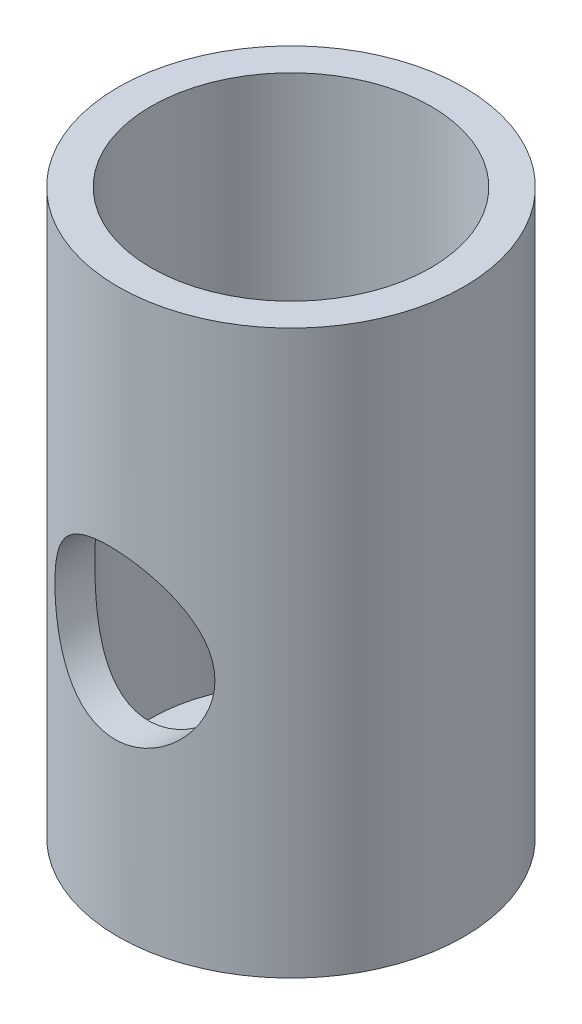
ISO-10303-21;
HEADER;
FILE_DESCRIPTION(('STEP AP214'),'2;1');
FILE_NAME('part.step','',(''),(''),'','','');
FILE_SCHEMA(('AUTOMOTIVE_DESIGN { 1 0 10303 214 1 1 1 1 }'));
ENDSEC;
DATA;
#1=APPLICATION_CONTEXT('core data for automotive mechanical design processes');
#2=APPLICATION_PROTOCOL_DEFINITION('international standard','automotive_design',2000,#1);
#3=PRODUCT_CONTEXT('',#1,'mechanical');
#4=PRODUCT('Part','Part','',(#3));
#5=PRODUCT_RELATED_PRODUCT_CATEGORY('part','',(#4));
#6=PRODUCT_DEFINITION_FORMATION('','',#4);
#7=PRODUCT_DEFINITION_CONTEXT('part definition',#1,'design');
#8=PRODUCT_DEFINITION('design','',#6,#7);
#9=PRODUCT_DEFINITION_SHAPE('','',#8);
#10=(LENGTH_UNIT() NAMED_UNIT(*) SI_UNIT(.MILLI.,.METRE.));
#11=(NAMED_UNIT(*) PLANE_ANGLE_UNIT() SI_UNIT($,.RADIAN.));
#12=(NAMED_UNIT(*) SI_UNIT($,.STERADIAN.) SOLID_ANGLE_UNIT());
#13=UNCERTAINTY_MEASURE_WITH_UNIT(LENGTH_MEASURE(1.E-05),#10,'distance_accuracy_value','');
#14=(GEOMETRIC_REPRESENTATION_CONTEXT(3) GLOBAL_UNCERTAINTY_ASSIGNED_CONTEXT((#13)) GLOBAL_UNIT_ASSIGNED_CONTEXT((#10,
#11,#12)) REPRESENTATION_CONTEXT('',''));
#15=CARTESIAN_POINT('',(0.,0.,0.));
#16=DIRECTION('',(0.,0.,1.));
#17=DIRECTION('',(1.,0.,0.));
#18=AXIS2_PLACEMENT_3D('',#15,#16,#17);
#19=CARTESIAN_POINT('',(0.,8.34615384615383,0.));
#20=DIRECTION('',(0.,1.,0.));
#21=DIRECTION('',(0.,0.,1.));
#22=AXIS2_PLACEMENT_3D('',#19,#20,#21);
#23=CYLINDRICAL_SURFACE('',#22,4.25);
#24=CARTESIAN_POINT('',(0.,-6.1841287743049,4.25));
#25=CARTESIAN_POINT('',(-0.126514666618864,-6.18999383435395,4.24999357675358));
#26=CARTESIAN_POINT('',(-0.253690544824862,-6.18621727224472,4.24428961678559));
#27=CARTESIAN_POINT('',(-0.505174990812462,-6.15950782159321,4.22176751840019));
#28=CARTESIAN_POINT('',(-0.629476029136012,-6.13652944570461,4.20492300881492));
#29=CARTESIAN_POINT('',(-0.871018738387213,-6.07269274435159,4.16158855279518));
#30=CARTESIAN_POINT('',(-0.988287978038754,-6.03191025681268,4.13513959671847));
#31=CARTESIAN_POINT('',(-1.21367958466996,-5.9342082029281,4.07469224340072));
#32=CARTESIAN_POINT('',(-1.3218039707566,-5.87729221086477,4.04069551868434));
#33=CARTESIAN_POINT('',(-1.53381237306319,-5.74498566002787,3.96527125665009));
#34=CARTESIAN_POINT('',(-1.63698126462261,-5.66864532277555,3.92350725096742));
#35=CARTESIAN_POINT('',(-1.82974834727165,-5.50150390378703,3.8374067317543));
#36=CARTESIAN_POINT('',(-1.91933173664799,-5.41068726755903,3.7930674841264));
#37=CARTESIAN_POINT('',(-2.09426877256489,-5.2036116362868,3.69967236270858));
#38=CARTESIAN_POINT('',(-2.17760701788026,-5.08558345882298,3.65074074508858));
#39=CARTESIAN_POINT('',(-2.32350862182033,-4.83494867455851,3.55966548219708));
#40=CARTESIAN_POINT('',(-2.38609165861652,-4.70235603616597,3.51751542691352));
#41=CARTESIAN_POINT('',(-2.47754406867953,-4.45364265090442,3.45351048312897));
#42=CARTESIAN_POINT('',(-2.51069464631352,-4.33971716241002,3.42926645817422));
#43=CARTESIAN_POINT('',(-2.56087229612731,-4.10665113582559,3.39196573914914));
#44=CARTESIAN_POINT('',(-2.57792086795207,-3.98751777451828,3.3788941297226));
#45=CARTESIAN_POINT('',(-2.59499643547816,-3.74685172088692,3.36580205868286));
#46=CARTESIAN_POINT('',(-2.59496115240666,-3.62531186504052,3.36582934878257));
#47=CARTESIAN_POINT('',(-2.57771157351003,-3.38416213535658,3.37905440543921));
#48=CARTESIAN_POINT('',(-2.5604886278881,-3.26455326409748,3.39225880345659));
#49=CARTESIAN_POINT('',(-2.51108019565003,-3.03635055830551,3.42897235946233));
#50=CARTESIAN_POINT('',(-2.47964981382018,-2.92750350601173,3.45195840136881));
#51=CARTESIAN_POINT('',(-2.4033522226344,-2.71663804365373,3.50550457872394));
#52=CARTESIAN_POINT('',(-2.35848010215552,-2.61462214614226,3.53606748177752));
#53=CARTESIAN_POINT('',(-2.24898322052313,-2.40432715849895,3.60685611183844));
#54=CARTESIAN_POINT('',(-2.18243055865302,-2.29731001637681,3.64784118870707));
#55=CARTESIAN_POINT('',(-2.03451340901586,-2.09510543361018,3.73236094898881));
#56=CARTESIAN_POINT('',(-1.95313602922578,-1.99992841168536,3.77589782899951));
#57=CARTESIAN_POINT('',(-1.76293361362987,-1.80894174272526,3.86877738084415));
#58=CARTESIAN_POINT('',(-1.65180832134746,-1.71533338902338,3.91797058454251));
#59=CARTESIAN_POINT('',(-1.41293139861074,-1.5482000202233,4.01029344257288));
#60=CARTESIAN_POINT('',(-1.2851822656441,-1.47467199348259,4.05342400570683));
#61=CARTESIAN_POINT('',(-1.08555899881474,-1.38281409172062,4.10958371322555));
#62=CARTESIAN_POINT('',(-1.01880850826964,-1.35556325383551,4.12667256667526));
#63=CARTESIAN_POINT('',(-0.882580649020144,-1.30685885172821,4.15793480397587));
#64=CARTESIAN_POINT('',(-0.813104783309145,-1.28540214222901,4.17210976859648));
#65=CARTESIAN_POINT('',(-0.67202042884362,-1.24861953950318,4.19714367097884));
#66=CARTESIAN_POINT('',(-0.6004136951346,-1.23328874317741,4.20800525906891));
#67=CARTESIAN_POINT('',(-0.455708543658157,-1.20898489536705,4.22612811744373));
#68=CARTESIAN_POINT('',(-0.382610363394658,-1.20001083961457,4.2333899563794));
#69=CARTESIAN_POINT('',(-0.181935087646649,-1.18443818691528,4.24800800708538));
#70=CARTESIAN_POINT('',(-0.0534915765804219,-1.18434087929156,4.25157350709012));
#71=CARTESIAN_POINT('',(0.201605679363006,-1.20375397418313,4.24713593635522));
#72=CARTESIAN_POINT('',(0.328259647696081,-1.22326190630139,4.2391343230969));
#73=CARTESIAN_POINT('',(0.570424400935169,-1.27949639530463,4.2132261721413));
#74=CARTESIAN_POINT('',(0.686179968692407,-1.31539782523347,4.19578759780555));
#75=CARTESIAN_POINT('',(0.910120277557902,-1.40261254074907,4.1529743182449));
#76=CARTESIAN_POINT('',(1.0183037273232,-1.45392844725046,4.12759826338439));
#77=CARTESIAN_POINT('',(1.23425590034486,-1.57542819818207,4.0685021541934));
#78=CARTESIAN_POINT('',(1.34117119839328,-1.64686436933713,4.03424854914975));
#79=CARTESIAN_POINT('',(1.54230637078616,-1.80421182805936,3.96172275856481));
#80=CARTESIAN_POINT('',(1.63651369483395,-1.89013723940924,3.92344666584402));
#81=CARTESIAN_POINT('',(1.82230950679165,-2.08704330119518,3.84100405010942));
#82=CARTESIAN_POINT('',(1.91194006083298,-2.19983145151491,3.7967224601713));
#83=CARTESIAN_POINT('',(2.07120125371938,-2.44013756777743,3.71224452977605));
#84=CARTESIAN_POINT('',(2.14084279813082,-2.56764744841272,3.67204596947216));
#85=CARTESIAN_POINT('',(2.24716325220022,-2.81137155295058,3.6077577978193));
#86=CARTESIAN_POINT('',(2.28750172825658,-2.92556162884501,3.58207472263222));
#87=CARTESIAN_POINT('',(2.35119718021974,-3.16025597574136,3.54059839948225));
#88=CARTESIAN_POINT('',(2.37457714446191,-3.28075146075516,3.52479176742166));
#89=CARTESIAN_POINT('',(2.40309640665322,-3.52552758175673,3.50541702513897));
#90=CARTESIAN_POINT('',(2.40814400151191,-3.6498241192746,3.50191044583025));
#91=CARTESIAN_POINT('',(2.39937479332966,-3.89744805113943,3.50792286418429));
#92=CARTESIAN_POINT('',(2.38555322147207,-4.02077519256675,3.51744515464306));
#93=CARTESIAN_POINT('',(2.34168510363635,-4.25353781665026,3.54677645448124));
#94=CARTESIAN_POINT('',(2.31291493449706,-4.36332593264543,3.5657720758225));
#95=CARTESIAN_POINT('',(2.2413188959296,-4.57656194764027,3.6112018145413));
#96=CARTESIAN_POINT('',(2.19848741288769,-4.68000729484828,3.63763890212854));
#97=CARTESIAN_POINT('',(2.09389428545067,-4.89170512976959,3.69894804539195));
#98=CARTESIAN_POINT('',(2.03042931052664,-4.99892591250037,3.73446278193416));
#99=CARTESIAN_POINT('',(1.88890203685276,-5.20233201323108,3.80800642879627));
#100=CARTESIAN_POINT('',(1.81082935259192,-5.29850940081483,3.84603711534574));
#101=CARTESIAN_POINT('',(1.62700370253564,-5.49386807095238,3.92773600867962));
#102=CARTESIAN_POINT('',(1.51880284110005,-5.59081546321852,3.97127207593085));
#103=CARTESIAN_POINT('',(1.28586921846299,-5.76580943233594,4.05268047724306));
#104=CARTESIAN_POINT('',(1.16112561946813,-5.84384352275468,4.0905490633966));
#105=CARTESIAN_POINT('',(0.964208398986665,-5.94421996695848,4.1397320819291));
#106=CARTESIAN_POINT('',(0.897093258983838,-5.97485070182926,4.15483165619078));
#107=CARTESIAN_POINT('',(0.759945757492538,-6.03030794919778,4.18208754173388));
#108=CARTESIAN_POINT('',(0.689915066477385,-6.05513773288055,4.19424551193879));
#109=CARTESIAN_POINT('',(0.547699899983057,-6.09857405875874,4.21517237649846));
#110=CARTESIAN_POINT('',(0.475522716769744,-6.11719951953836,4.22395158652585));
#111=CARTESIAN_POINT('',(0.329503532965402,-6.14801768956562,4.23784093936173));
#112=CARTESIAN_POINT('',(0.25566304538905,-6.16021601692259,4.24295428800148));
#113=CARTESIAN_POINT('',(0.151263677620319,-6.17269531153148,4.24741442638629));
#114=CARTESIAN_POINT('',(0.121080707660853,-6.17574934705927,4.2483821572176));
#115=CARTESIAN_POINT('',(0.0606111605110757,-6.18076322272879,4.24967574242153));
#116=CARTESIAN_POINT('',(0.0303245743299795,-6.18272296536464,4.25000153960184));
#117=CARTESIAN_POINT('',(0.,-6.1841287743049,4.25));
#118=B_SPLINE_CURVE_WITH_KNOTS('',3,(#24,#25,#26,#27,#28,#29,#30,#31,#32,#33,#34,#35,#36,#37,
#38,#39,#40,#41,#42,#43,#44,#45,#46,#47,#48,#49,#50,#51,#52,#53,#54,#55,#56,#57,#58,#59,#60,#61,
#62,#63,#64,#65,#66,#67,#68,#69,#70,#71,#72,#73,#74,#75,#76,#77,#78,#79,#80,#81,#82,#83,#84,#85,
#86,#87,#88,#89,#90,#91,#92,#93,#94,#95,#96,#97,#98,#99,#100,#101,#102,#103,#104,#105,#106,#107,
#108,#109,#110,#111,#112,#113,#114,#115,#116,#117),.UNSPECIFIED.,.T.,.F.,(4,2,2,2,2,2,2,2,2,2,2,
2,2,2,2,2,2,2,2,2,2,2,2,2,2,2,2,2,2,2,2,2,2,2,2,2,2,2,2,2,2,2,2,2,2,2,4),(0.,0.379829153106347,
0.760560646015882,1.13968597170252,1.51872736997747,1.92204551536012,2.32579997592246,
2.78132798436538,3.23642286023476,3.5982258027192,3.95954497457143,4.3221813364587,
4.68500028940197,5.03046462091768,5.3760553268178,5.77212875702492,6.16854828331844,
6.6265872615563,7.08455750544692,7.3065702503893,7.52846223484674,7.75017626245955,
7.97185525482667,8.35514394945396,8.73838435308527,9.10416122651134,9.47000032800766,
9.86763896110209,10.2656674680136,10.7158110881104,11.165708650843,11.5355937330201,
11.904976470721,12.276204427787,12.6475262229045,12.9913693551252,13.335349925039,
13.722592784186,14.1101120113006,14.5630513636229,15.0162889338302,15.2419219100951,
15.4674273420372,15.6922387170591,15.9168532517452,16.007887213538,16.0989292855277),.UNSPECIFIED.);
#119=CARTESIAN_POINT('',(0.,-6.1841287743049,4.25));
#120=VERTEX_POINT('',#119);
#121=EDGE_CURVE('E81',#120,#120,#118,.T.);
#122=ORIENTED_EDGE('',*,*,#121,.F.);
#123=EDGE_LOOP('',(#122));
#124=FACE_BOUND('',#123,.T.);
#125=CARTESIAN_POINT('',(2.59284200411313,-3.68681939527953,-3.36744270058254));
#126=CARTESIAN_POINT('',(2.59284415220385,-3.56043270982859,-3.36743977286373));
#127=CARTESIAN_POINT('',(2.58339559429246,-3.4340571917981,-3.37477916132106));
#128=CARTESIAN_POINT('',(2.54624608856951,-3.18551481318329,-3.40288829542865));
#129=CARTESIAN_POINT('',(2.51852640738754,-3.06335240772422,-3.42367182494));
#130=CARTESIAN_POINT('',(2.44658419144467,-2.82734776399845,-3.4754351606602));
#131=CARTESIAN_POINT('',(2.4024755143808,-2.71345445679809,-3.50634444982034));
#132=CARTESIAN_POINT('',(2.2993030219013,-2.49488562791326,-3.57484744079851));
#133=CARTESIAN_POINT('',(2.24023447384262,-2.39021303740703,-3.61244325681582));
#134=CARTESIAN_POINT('',(2.10067851866628,-2.17961323028469,-3.69553543052024));
#135=CARTESIAN_POINT('',(2.01849364681623,-2.0749722310546,-3.74144149683859));
#136=CARTESIAN_POINT('',(1.83836378486604,-1.88010399032773,-3.83316415581972));
#137=CARTESIAN_POINT('',(1.74040770352969,-1.7898869822729,-3.87898066237803));
#138=CARTESIAN_POINT('',(1.51923229526114,-1.6172971268631,-3.97117087973103));
#139=CARTESIAN_POINT('',(1.3944530238858,-1.53667418400921,-4.01712100315428));
#140=CARTESIAN_POINT('',(1.12987341699404,-1.39837409684681,-4.09939155616356));
#141=CARTESIAN_POINT('',(0.990086425563689,-1.34067677939849,-4.1357204424157));
#142=CARTESIAN_POINT('',(0.713070096690742,-1.2555513957581,-4.19191098129795));
#143=CARTESIAN_POINT('',(0.576801259803329,-1.22581622979372,-4.21298544507584));
#144=CARTESIAN_POINT('',(0.299856954676447,-1.18968496271981,-4.2416860733077));
#145=CARTESIAN_POINT('',(0.159185532488307,-1.18326803220993,-4.24932423681093));
#146=CARTESIAN_POINT('',(-0.104465981241452,-1.19348493478511,-4.25051529014477));
#147=CARTESIAN_POINT('',(-0.227554192142381,-1.20745966384652,-4.24564011475217));
#148=CARTESIAN_POINT('',(-0.469549131632264,-1.25304753407556,-4.22572618334815));
#149=CARTESIAN_POINT('',(-0.588455550620177,-1.2846619782982,-4.21068667647491));
#150=CARTESIAN_POINT('',(-0.819977111325494,-1.36441419869967,-4.17181404796222));
#151=CARTESIAN_POINT('',(-0.932541195835752,-1.41266849200855,-4.147918825363));
#152=CARTESIAN_POINT('',(-1.14832181492216,-1.52394067413266,-4.09344084046244));
#153=CARTESIAN_POINT('',(-1.25153577280166,-1.58696261554068,-4.06285624259164));
#154=CARTESIAN_POINT('',(-1.45857223279885,-1.73430761995599,-3.9935361733302));
#155=CARTESIAN_POINT('',(-1.56105554914368,-1.82025950694558,-3.95426582869307));
#156=CARTESIAN_POINT('',(-1.75105761437764,-2.00680810558783,-3.87388251218567));
#157=CARTESIAN_POINT('',(-1.83855661676525,-2.10742382326416,-3.83276719762934));
#158=CARTESIAN_POINT('',(-2.00564482737587,-2.3334914291899,-3.74827534678366));
#159=CARTESIAN_POINT('',(-2.08332945271227,-2.46045534885354,-3.70514153385681));
#160=CARTESIAN_POINT('',(-2.21556694844077,-2.72829567897284,-3.62762667285151));
#161=CARTESIAN_POINT('',(-2.27016194293263,-2.86914617093663,-3.59322973167139));
#162=CARTESIAN_POINT('',(-2.34314096965645,-3.12603900491953,-3.54592804344307));
#163=CARTESIAN_POINT('',(-2.36707129624866,-3.23992088070366,-3.52984626677697));
#164=CARTESIAN_POINT('',(-2.39853847709991,-3.4708811871911,-3.50854583974423));
#165=CARTESIAN_POINT('',(-2.40609295542564,-3.58795604394084,-3.50331551105866));
#166=CARTESIAN_POINT('',(-2.40436558990165,-3.82203409434476,-3.50450073796037));
#167=CARTESIAN_POINT('',(-2.39506640446923,-3.93903709012681,-3.51092828893175));
#168=CARTESIAN_POINT('',(-2.36017519595914,-4.16950435446358,-3.53447285609251));
#169=CARTESIAN_POINT('',(-2.33457068470238,-4.2829658406583,-3.55159806538067));
#170=CARTESIAN_POINT('',(-2.26820310747023,-4.50421684281691,-3.59434296938122));
#171=CARTESIAN_POINT('',(-2.22736671044123,-4.61197599252573,-3.62000369095848));
#172=CARTESIAN_POINT('',(-2.13201030300669,-4.81961724591989,-3.6769704809898));
#173=CARTESIAN_POINT('',(-2.07748495833774,-4.91949625891299,-3.70827874881893));
#174=CARTESIAN_POINT('',(-1.94536255797351,-5.12702664086778,-3.77950057978961));
#175=CARTESIAN_POINT('',(-1.86539877399956,-5.23298604646701,-3.81996182968313));
#176=CARTESIAN_POINT('',(-1.68985742931875,-5.43123055098277,-3.90079936177709));
#177=CARTESIAN_POINT('',(-1.59426570352933,-5.52350309812734,-3.94117553291746));
#178=CARTESIAN_POINT('',(-1.37684436873676,-5.70259348610109,-4.02265930342844));
#179=CARTESIAN_POINT('',(-1.25325335226621,-5.78750909599826,-4.06329947675685));
#180=CARTESIAN_POINT('',(-0.990931098913845,-5.93512385489279,-4.13509281803652));
#181=CARTESIAN_POINT('',(-0.852210963513369,-5.99783915251383,-4.16625287954261));
#182=CARTESIAN_POINT('',(-0.574688004781045,-6.09397174299784,-4.21313176776311));
#183=CARTESIAN_POINT('',(-0.436713912115765,-6.12927304432844,-4.22985476795968));
#184=CARTESIAN_POINT('',(-0.155865230961745,-6.17604974361841,-4.24946419672817));
#185=CARTESIAN_POINT('',(-0.0129958150158259,-6.1875495470081,-4.25236480240001));
#186=CARTESIAN_POINT('',(0.254053826516153,-6.18611236447814,-4.24423457422322));
#187=CARTESIAN_POINT('',(0.378314190184773,-6.17607990900319,-4.23491799564233));
#188=CARTESIAN_POINT('',(0.622746356137685,-6.13785244135407,-4.2059278022183));
#189=CARTESIAN_POINT('',(0.74291803358543,-6.10965687514334,-4.18625387144407));
#190=CARTESIAN_POINT('',(0.975116098223649,-6.03672750988245,-4.13830974046805));
#191=CARTESIAN_POINT('',(1.08720161337546,-5.99213236980307,-4.11011195567485));
#192=CARTESIAN_POINT('',(1.30217885749524,-5.88802932616895,-4.04714622180622));
#193=CARTESIAN_POINT('',(1.40506835210519,-5.82851781167147,-4.01237668234815));
#194=CARTESIAN_POINT('',(1.6109060435566,-5.68893657128946,-3.93457420596166));
#195=CARTESIAN_POINT('',(1.71262487763647,-5.60732857020849,-3.89105326161103));
#196=CARTESIAN_POINT('',(1.9016741384695,-5.42953902585991,-3.80224529511432));
#197=CARTESIAN_POINT('',(1.98898758616951,-5.33334053797708,-3.75695626562162));
#198=CARTESIAN_POINT('',(2.15732960497347,-5.11573600849875,-3.66316272328516));
#199=CARTESIAN_POINT('',(2.23640152449953,-4.99269501010383,-3.61490918881245));
#200=CARTESIAN_POINT('',(2.37277636873223,-4.73230690622967,-3.52690284232553));
#201=CARTESIAN_POINT('',(2.43010188081769,-4.59497483452628,-3.48714122886215));
#202=CARTESIAN_POINT('',(2.51362627326231,-4.33019613700448,-3.42730820010169));
#203=CARTESIAN_POINT('',(2.54316950192293,-4.20428001091333,-3.40519734354361));
#204=CARTESIAN_POINT('',(2.58276101961938,-3.94784006613291,-3.3752772840322));
#205=CARTESIAN_POINT('',(2.59283978603729,-3.8173237772329,-3.36744572368685));
#206=CARTESIAN_POINT('',(2.59284200411313,-3.68681939527953,-3.36744270058254));
#207=B_SPLINE_CURVE_WITH_KNOTS('',3,(#125,#126,#127,#128,#129,#130,#131,#132,#133,#134,#135,
#136,#137,#138,#139,#140,#141,#142,#143,#144,#145,#146,#147,#148,#149,#150,#151,#152,#153,#154,
#155,#156,#157,#158,#159,#160,#161,#162,#163,#164,#165,#166,#167,#168,#169,#170,#171,#172,#173,
#174,#175,#176,#177,#178,#179,#180,#181,#182,#183,#184,#185,#186,#187,#188,#189,#190,#191,#192,
#193,#194,#195,#196,#197,#198,#199,#200,#201,#202,#203,#204,#205,#206),.UNSPECIFIED.,.T.,.F.,(4,
2,2,2,2,2,2,2,2,2,2,2,2,2,2,2,2,2,2,2,2,2,2,2,2,2,2,2,2,2,2,2,2,2,2,2,2,2,2,2,4),(0.,
0.378613275481539,0.757615348000445,1.13403220145297,1.51056828566074,1.93116144998214,
2.35205170246896,2.81605180661519,3.27964271020139,3.70033094777358,4.12064330610089,
4.49080308687508,4.86099021516698,5.23382398600492,5.60676019134102,6.02329014830462,
6.44036485842647,6.9029445871221,7.36467671888197,7.71557767181679,8.06610078914523,
8.41698478213428,8.76813783941288,9.12100374781948,9.474007373842,9.88869995713499,
10.3037705209631,10.7674183259368,11.2307281746553,11.658365498045,12.0855641156922,
12.4587756980608,12.8319986651897,13.2021359692981,13.5723629626045,13.9831647186666,
14.394447263709,14.8542501925614,15.313574220876,15.7051363769045,16.0960849276934),.UNSPECIFIED.);
#208=CARTESIAN_POINT('',(2.59284200411313,-3.68681939527953,-3.36744270058254));
#209=VERTEX_POINT('',#208);
#210=EDGE_CURVE('E62',#209,#209,#207,.T.);
#211=ORIENTED_EDGE('',*,*,#210,.F.);
#212=EDGE_LOOP('',(#211));
#213=FACE_BOUND('',#212,.T.);
#214=CARTESIAN_POINT('',(0.,5.76923076923076,0.));
#215=DIRECTION('',(0.,1.,0.));
#216=DIRECTION('',(0.,0.,1.));
#217=AXIS2_PLACEMENT_3D('',#214,#215,#216);
#218=CIRCLE('',#217,4.25);
#219=CARTESIAN_POINT('',(0.,5.76923076923076,4.25));
#220=VERTEX_POINT('',#219);
#221=EDGE_CURVE('E46',#220,#220,#218,.T.);
#222=ORIENTED_EDGE('',*,*,#221,.T.);
#223=EDGE_LOOP('',(#222));
#224=FACE_BOUND('',#223,.T.);
#225=CARTESIAN_POINT('',(0.,-10.3286562181495,0.));
#226=DIRECTION('',(0.,1.,0.));
#227=DIRECTION('',(0.,0.,1.));
#228=AXIS2_PLACEMENT_3D('',#225,#226,#227);
#229=CIRCLE('',#228,4.25);
#230=CARTESIAN_POINT('',(0.,-10.3286562181495,4.25));
#231=VERTEX_POINT('',#230);
#232=EDGE_CURVE('E86',#231,#231,#229,.T.);
#233=ORIENTED_EDGE('',*,*,#232,.F.);
#234=EDGE_LOOP('',(#233));
#235=FACE_BOUND('',#234,.T.);
#236=ADVANCED_FACE('F35',(#124,#213,#224,#235),#23,.F.);
#237=CARTESIAN_POINT('',(-4.25,5.76923076923076,0.));
#238=DIRECTION('',(0.,1.,0.));
#239=DIRECTION('',(0.,0.,1.));
#240=AXIS2_PLACEMENT_3D('',#237,#238,#239);
#241=PLANE('',#240);
#242=CARTESIAN_POINT('',(0.,5.76923076923076,0.));
#243=DIRECTION('',(0.,1.,0.));
#244=DIRECTION('',(0.,0.,1.));
#245=AXIS2_PLACEMENT_3D('',#242,#243,#244);
#246=CIRCLE('',#245,5.25);
#247=CARTESIAN_POINT('',(0.,5.76923076923076,5.25));
#248=VERTEX_POINT('',#247);
#249=EDGE_CURVE('E50',#248,#248,#246,.T.);
#250=ORIENTED_EDGE('',*,*,#249,.T.);
#251=EDGE_LOOP('',(#250));
#252=FACE_BOUND('',#251,.T.);
#253=ORIENTED_EDGE('',*,*,#221,.F.);
#254=EDGE_LOOP('',(#253));
#255=FACE_BOUND('',#254,.T.);
#256=ADVANCED_FACE('F100',(#252,#255),#241,.T.);
#257=CARTESIAN_POINT('',(0.,8.34615384615383,0.));
#258=DIRECTION('',(0.,1.,0.));
#259=DIRECTION('',(0.,0.,1.));
#260=AXIS2_PLACEMENT_3D('',#257,#258,#259);
#261=CYLINDRICAL_SURFACE('',#260,5.25);
#262=CARTESIAN_POINT('',(0.,-6.1827124740607,5.25));
#263=CARTESIAN_POINT('',(0.133667412184147,-6.17503561292849,5.24999290672069));
#264=CARTESIAN_POINT('',(0.266912573426058,-6.15657778699609,5.24483829454792));
#265=CARTESIAN_POINT('',(0.528268647366457,-6.09890774614734,5.22500827757819));
#266=CARTESIAN_POINT('',(0.65636661994065,-6.05964636267098,5.21031029870451));
#267=CARTESIAN_POINT('',(0.903278326359517,-5.96218407101487,5.17321067988767));
#268=CARTESIAN_POINT('',(1.02212876555517,-5.90406333379589,5.15084162712887));
#269=CARTESIAN_POINT('',(1.24848377588286,-5.77076228945124,5.10071038627286));
#270=CARTESIAN_POINT('',(1.35599029269609,-5.69558491482824,5.07294912536171));
#271=CARTESIAN_POINT('',(1.56401021728013,-5.52484919446269,5.0128646687188));
#272=CARTESIAN_POINT('',(1.66366977115651,-5.42831240311109,4.98036496429576));
#273=CARTESIAN_POINT('',(1.84596634160227,-5.2201091537041,4.91571781577675));
#274=CARTESIAN_POINT('',(1.92859253182294,-5.10843314749314,4.88357060793964));
#275=CARTESIAN_POINT('',(2.07830702119726,-4.86623733501714,4.82182853531091));
#276=CARTESIAN_POINT('',(2.14442220951973,-4.73505789284722,4.79243915029321));
#277=CARTESIAN_POINT('',(2.25285297954254,-4.46166987751945,4.74244264520595));
#278=CARTESIAN_POINT('',(2.29519276319679,-4.31947268823498,4.72182659959364));
#279=CARTESIAN_POINT('',(2.35141151141518,-4.0404402566549,4.69406814734533));
#280=CARTESIAN_POINT('',(2.3673315280939,-3.90411478114657,4.68596329697701));
#281=CARTESIAN_POINT('',(2.37626193879519,-3.63055062156105,4.68144408215215));
#282=CARTESIAN_POINT('',(2.36928367123176,-3.49331242301919,4.68502393184408));
#283=CARTESIAN_POINT('',(2.33452498093316,-3.23490796800436,4.7024248568769));
#284=CARTESIAN_POINT('',(2.30867597914178,-3.11340792580523,4.71529389120657));
#285=CARTESIAN_POINT('',(2.23954214577148,-2.87656506188762,4.74851675203492));
#286=CARTESIAN_POINT('',(2.19625217848359,-2.76122406511635,4.76887278301888));
#287=CARTESIAN_POINT('',(2.09098795978021,-2.53313223514653,4.81598919866427));
#288=CARTESIAN_POINT('',(2.0281447535924,-2.42084297756622,4.84303192111431));
#289=CARTESIAN_POINT('',(1.88648316054336,-2.20762039676592,4.89994956767691));
#290=CARTESIAN_POINT('',(1.80765648950262,-2.10669300472468,4.9298259561783));
#291=CARTESIAN_POINT('',(1.62609571412854,-1.90740894199567,4.99284727493015));
#292=CARTESIAN_POINT('',(1.52168069664405,-1.81057498097348,5.02598773592372));
#293=CARTESIAN_POINT('',(1.29736539816307,-1.63528851945046,5.0885057816386));
#294=CARTESIAN_POINT('',(1.17746221266681,-1.55683947446263,5.11788265851072));
#295=CARTESIAN_POINT('',(0.923464631992009,-1.42002297499251,5.16978510096429));
#296=CARTESIAN_POINT('',(0.789227124915755,-1.36188877878397,5.19223076128133));
#297=CARTESIAN_POINT('',(0.511550015058087,-1.26947740135278,5.22688527293448));
#298=CARTESIAN_POINT('',(0.368117917083391,-1.23518102734556,5.23910236132832));
#299=CARTESIAN_POINT('',(0.0897655655996365,-1.19409271803951,5.25091681123033));
#300=CARTESIAN_POINT('',(-0.0447958783247586,-1.18514969300162,5.25152829055952));
#301=CARTESIAN_POINT('',(-0.313234118454166,-1.18900153590244,5.24236586416683));
#302=CARTESIAN_POINT('',(-0.447111080194717,-1.20179087183483,5.23259460162527));
#303=CARTESIAN_POINT('',(-0.703187228727458,-1.2472541776098,5.20420841113074));
#304=CARTESIAN_POINT('',(-0.825632310858249,-1.27886585654938,5.18607685110665));
#305=CARTESIAN_POINT('',(-1.06314622204047,-1.35980699131069,5.14264599630699));
#306=CARTESIAN_POINT('',(-1.17821383771576,-1.4091393528986,5.11734552614618));
#307=CARTESIAN_POINT('',(-1.40400776359281,-1.52675612616728,5.06018676129155));
#308=CARTESIAN_POINT('',(-1.51424369954822,-1.59585198115084,5.02806752153169));
#309=CARTESIAN_POINT('',(-1.72197360395285,-1.74991888956491,4.96077112899329));
#310=CARTESIAN_POINT('',(-1.81946063305978,-1.83489852805332,4.92559232807037));
#311=CARTESIAN_POINT('',(-2.00821599650021,-2.02730102421488,4.85188016864264));
#312=CARTESIAN_POINT('',(-2.09812210342983,-2.13605928221521,4.81333147117907));
#313=CARTESIAN_POINT('',(-2.25880765045974,-2.36811924966112,4.74005343317695));
#314=CARTESIAN_POINT('',(-2.32958179682508,-2.491424970801,4.70532515130488));
#315=CARTESIAN_POINT('',(-2.45048811366789,-2.75136871746185,4.64352144624198));
#316=CARTESIAN_POINT('',(-2.50038751689906,-2.88813710844241,4.6165333230619));
#317=CARTESIAN_POINT('',(-2.5760918478405,-3.16990519510715,4.57473193932841));
#318=CARTESIAN_POINT('',(-2.60192745712881,-3.31489415842187,4.55990317836222));
#319=CARTESIAN_POINT('',(-2.62666569891049,-3.59220804832046,4.54568959203173));
#320=CARTESIAN_POINT('',(-2.62815181272268,-3.72423023812662,4.54482350494997));
#321=CARTESIAN_POINT('',(-2.61070019974502,-3.98645314376701,4.55487042350493));
#322=CARTESIAN_POINT('',(-2.59176324710344,-4.11665392845316,4.56578298266521));
#323=CARTESIAN_POINT('',(-2.53592146595711,-4.36460307844563,4.59701439447393));
#324=CARTESIAN_POINT('',(-2.50001071044569,-4.48264641684798,4.61681009798805));
#325=CARTESIAN_POINT('',(-2.41199300310779,-4.71104164997635,4.6633956923822));
#326=CARTESIAN_POINT('',(-2.3598808999014,-4.82139108466727,4.69018780740673));
#327=CARTESIAN_POINT('',(-2.23551730852651,-5.04189551496554,4.75080513092222));
#328=CARTESIAN_POINT('',(-2.1618848938881,-5.15115674871829,4.78504433534415));
#329=CARTESIAN_POINT('',(-1.99868478122799,-5.3563708366741,4.85547743374741));
#330=CARTESIAN_POINT('',(-1.90910886678737,-5.45231678330677,4.89167232885601));
#331=CARTESIAN_POINT('',(-1.70663509188446,-5.63725843610879,4.96614091015281));
#332=CARTESIAN_POINT('',(-1.59234613864381,-5.72478940430789,5.00429702307923));
#333=CARTESIAN_POINT('',(-1.34904438497786,-5.87924572050768,5.07529730405675));
#334=CARTESIAN_POINT('',(-1.22002815714699,-5.94616625848989,5.10814023128013));
#335=CARTESIAN_POINT('',(-0.954284791108047,-6.0551815616704,5.16426861655076));
#336=CARTESIAN_POINT('',(-0.817884745149495,-6.09793303783473,5.18780107772198));
#337=CARTESIAN_POINT('',(-0.608618169866725,-6.14403291367393,5.21508117864804));
#338=CARTESIAN_POINT('',(-0.538138138661816,-6.1563925163864,5.22283536655193));
#339=CARTESIAN_POINT('',(-0.396139029293905,-6.1750015133108,5.23551661634423));
#340=CARTESIAN_POINT('',(-0.324620650100147,-6.18125484056631,5.24044549716291));
#341=CARTESIAN_POINT('',(-0.210810140438202,-6.18626165094242,5.24593553188973));
#342=CARTESIAN_POINT('',(-0.16864108405972,-6.18704553071101,5.24745978988208));
#343=CARTESIAN_POINT('',(-0.0843007030542893,-6.18648070145323,5.24949312284143));
#344=CARTESIAN_POINT('',(-0.0421293785705699,-6.18513207195361,5.25000223566421));
#345=CARTESIAN_POINT('',(0.,-6.1827124740607,5.25));
#346=B_SPLINE_CURVE_WITH_KNOTS('',3,(#262,#263,#264,#265,#266,#267,#268,#269,#270,#271,#272,
#273,#274,#275,#276,#277,#278,#279,#280,#281,#282,#283,#284,#285,#286,#287,#288,#289,#290,#291,
#292,#293,#294,#295,#296,#297,#298,#299,#300,#301,#302,#303,#304,#305,#306,#307,#308,#309,#310,
#311,#312,#313,#314,#315,#316,#317,#318,#319,#320,#321,#322,#323,#324,#325,#326,#327,#328,#329,
#330,#331,#332,#333,#334,#335,#336,#337,#338,#339,#340,#341,#342,#343,#344,#345),.UNSPECIFIED.,
.T.,.F.,(4,2,2,2,2,2,2,2,2,2,2,2,2,2,2,2,2,2,2,2,2,2,2,2,2,2,2,2,2,2,2,2,2,2,2,2,2,2,2,2,2,4),
(0.,0.401497172389765,0.803947531443717,1.2047090111509,1.6054016411362,2.03107548330645,
2.45701905379123,2.90407430892625,3.35067365948604,3.76081866409944,4.17076061018132,
4.54375754888957,4.91686440154935,5.30975357379767,5.70284690218202,6.13947643700589,
6.5761879722667,7.01776075007675,7.45897758684387,7.86144356379954,8.2638071077605,
8.64536711241408,9.02698971232299,9.42734534540616,9.82791799653583,10.2647591277228,
10.701721007623,11.1434331854994,11.5845814018797,11.9785794174286,12.3725624987774,
12.7458898097244,13.1193359454203,13.5260635427909,13.9330013557152,14.3775957948458,
14.8222939139963,15.254243329186,15.4699028337595,15.6854233405401,15.8119721896591,
15.9385163195576),.UNSPECIFIED.);
#347=CARTESIAN_POINT('',(0.,-6.1827124740607,5.25));
#348=VERTEX_POINT('',#347);
#349=EDGE_CURVE('E10',#348,#348,#346,.T.);
#350=ORIENTED_EDGE('',*,*,#349,.F.);
#351=EDGE_LOOP('',(#350));
#352=FACE_BOUND('',#351,.T.);
#353=CARTESIAN_POINT('',(2.62502641569567,-3.68681939527953,-4.54661811865698));
#354=CARTESIAN_POINT('',(2.62501737323339,-3.81802484651538,-4.54662919952542));
#355=CARTESIAN_POINT('',(2.61478788512826,-3.94942176628039,-4.55257707654867));
#356=CARTESIAN_POINT('',(2.57434043192817,-4.2082552331389,-4.57556332312592));
#357=CARTESIAN_POINT('',(2.54407655058988,-4.33568197700426,-4.5926271676066));
#358=CARTESIAN_POINT('',(2.46507279899777,-4.58235499191463,-4.63550498556274));
#359=CARTESIAN_POINT('',(2.41642404462073,-4.7016382349115,-4.66127574168072));
#360=CARTESIAN_POINT('',(2.30225304505562,-4.93020609222049,-4.7187075485038));
#361=CARTESIAN_POINT('',(2.23673129356168,-5.03949099895136,-4.75036842685982));
#362=CARTESIAN_POINT('',(2.08488056893069,-5.25396234789847,-4.81904664374292));
#363=CARTESIAN_POINT('',(1.99736579293746,-5.35823813718246,-4.85628727371897));
#364=CARTESIAN_POINT('',(1.80637508640011,-5.5511652019481,-4.93051789054923));
#365=CARTESIAN_POINT('',(1.70289183937898,-5.63980927515259,-4.96750775435551));
#366=CARTESIAN_POINT('',(1.47525409603587,-5.80412558560788,-5.03996114361904));
#367=CARTESIAN_POINT('',(1.35023392285054,-5.87870625849628,-5.07520140608769));
#368=CARTESIAN_POINT('',(1.0874211942487,-6.00521280020074,-5.13791944823919));
#369=CARTESIAN_POINT('',(0.949636021973759,-6.05715166682929,-5.1654016783155));
#370=CARTESIAN_POINT('',(0.67473244387212,-6.13338771510792,-5.20819537292121));
#371=CARTESIAN_POINT('',(0.538162416344718,-6.15927369703175,-5.22418656963112));
#372=CARTESIAN_POINT('',(0.261816581616253,-6.18787185604202,-5.24529448933204));
#373=CARTESIAN_POINT('',(0.122042552477089,-6.19059658855552,-5.25041710291728));
#374=CARTESIAN_POINT('',(-0.144917679293576,-6.17347527201849,-5.24956342864362));
#375=CARTESIAN_POINT('',(-0.272225464491944,-6.15539653500359,-5.24443255322688));
#376=CARTESIAN_POINT('',(-0.521983296171414,-6.10030358080273,-5.22548781163299));
#377=CARTESIAN_POINT('',(-0.64443298060509,-6.06328795520065,-5.21167329959973));
#378=CARTESIAN_POINT('',(-0.883193746768815,-5.97105132759709,-5.17660664086546));
#379=CARTESIAN_POINT('',(-0.999388321728119,-5.9155710407987,-5.1552482839434));
#380=CARTESIAN_POINT('',(-1.22126174391669,-5.78829666728709,-5.1072423153533));
#381=CARTESIAN_POINT('',(-1.32693672546538,-5.71649661506839,-5.08059277000291));
#382=CARTESIAN_POINT('',(-1.53461231994333,-5.55135236775727,-5.02196231589606));
#383=CARTESIAN_POINT('',(-1.63547595351679,-5.45667019725887,-4.98971875819064));
#384=CARTESIAN_POINT('',(-1.82048344201857,-5.25207773746992,-4.92523684931254));
#385=CARTESIAN_POINT('',(-1.90461649180097,-5.14215768432528,-4.8929985148537));
#386=CARTESIAN_POINT('',(-2.05805848575059,-4.90295838708367,-4.83054130988232));
#387=CARTESIAN_POINT('',(-2.12633476630237,-4.77295843940096,-4.80052247122684));
#388=CARTESIAN_POINT('',(-2.23931699723351,-4.50156019962344,-4.74887984596377));
#389=CARTESIAN_POINT('',(-2.28404548536907,-4.36017295641082,-4.72724803731772));
#390=CARTESIAN_POINT('',(-2.34517125364615,-4.08142218724264,-4.69720724037181));
#391=CARTESIAN_POINT('',(-2.36346868162963,-3.94457384427694,-4.68791580494897));
#392=CARTESIAN_POINT('',(-2.37688896469095,-3.6694856877613,-4.68112947003676));
#393=CARTESIAN_POINT('',(-2.37202502315634,-3.53124671179997,-4.68362784962936));
#394=CARTESIAN_POINT('',(-2.34101319789315,-3.27119815897421,-4.69919056708118));
#395=CARTESIAN_POINT('',(-2.31692281505585,-3.14907170789576,-4.71123275246764));
#396=CARTESIAN_POINT('',(-2.2511245011557,-2.91072667497694,-4.74302257117042));
#397=CARTESIAN_POINT('',(-2.20941146381464,-2.79450981642296,-4.76277243771069));
#398=CARTESIAN_POINT('',(-2.10752489473075,-2.56520505688133,-4.80875123205922));
#399=CARTESIAN_POINT('',(-2.04658638953335,-2.45251084788196,-4.83523769844608));
#400=CARTESIAN_POINT('',(-1.90873533184275,-2.23819508280712,-4.89129457553416));
#401=CARTESIAN_POINT('',(-1.83181476538862,-2.13657912087546,-4.92086652968852));
#402=CARTESIAN_POINT('',(-1.6541485062211,-1.93540125042788,-4.98358482761114));
#403=CARTESIAN_POINT('',(-1.55169856848018,-1.83734678981711,-5.01676021754236));
#404=CARTESIAN_POINT('',(-1.33120486164878,-1.65925044182096,-5.0797177730562));
#405=CARTESIAN_POINT('',(-1.21315730983312,-1.57921293666943,-5.10949911224176));
#406=CARTESIAN_POINT('',(-0.961865302736116,-1.43833402714762,-5.16275871484048));
#407=CARTESIAN_POINT('',(-0.828388910099053,-1.37785733932467,-5.18611612682879));
#408=CARTESIAN_POINT('',(-0.551768172534628,-1.28066652753867,-5.22278230322836));
#409=CARTESIAN_POINT('',(-0.408631617455159,-1.24393350393532,-5.23609906127552));
#410=CARTESIAN_POINT('',(-0.130064459051208,-1.19815431334188,-5.25008040071818));
#411=CARTESIAN_POINT('',(0.00497126199278369,-1.18700007374325,-5.25173393869934));
#412=CARTESIAN_POINT('',(0.274773400264363,-1.18664325614515,-5.24453887290273));
#413=CARTESIAN_POINT('',(0.409539883826173,-1.19743435984217,-5.23569329224094));
#414=CARTESIAN_POINT('',(0.667083594694635,-1.23920387772308,-5.20896724808898));
#415=CARTESIAN_POINT('',(0.79010939211615,-1.26901658334473,-5.19162112361834));
#416=CARTESIAN_POINT('',(1.02905037662572,-1.34650535597493,-5.14959049495361));
#417=CARTESIAN_POINT('',(1.1449644443504,-1.39418422670917,-5.12490483909728));
#418=CARTESIAN_POINT('',(1.3722251151265,-1.50834474122265,-5.06890621624824));
#419=CARTESIAN_POINT('',(1.48313364030591,-1.57557384371736,-5.0373456514301));
#420=CARTESIAN_POINT('',(1.69247326923808,-1.72595167696937,-4.97092696557729));
#421=CARTESIAN_POINT('',(1.79089864504459,-1.80910767223582,-4.93606734347479));
#422=CARTESIAN_POINT('',(1.98193060347313,-1.99779844286347,-4.86269985252658));
#423=CARTESIAN_POINT('',(2.07319501425117,-2.1046803389897,-4.82414839346528));
#424=CARTESIAN_POINT('',(2.23696710081928,-2.33311970446079,-4.75042744911769));
#425=CARTESIAN_POINT('',(2.30946065574299,-2.45468812188481,-4.7152605223572));
#426=CARTESIAN_POINT('',(2.43465552130802,-2.71240970071907,-4.65188231294955));
#427=CARTESIAN_POINT('',(2.48697319188338,-2.84878776811197,-4.62380905453361));
#428=CARTESIAN_POINT('',(2.5473392651775,-3.05956741249039,-4.59065038672084));
#429=CARTESIAN_POINT('',(2.56443545570998,-3.13079433939815,-4.58109405692636));
#430=CARTESIAN_POINT('',(2.59242772957818,-3.2748019052579,-4.56531300180614));
#431=CARTESIAN_POINT('',(2.60332828938211,-3.34758138291198,-4.55908587126041));
#432=CARTESIAN_POINT('',(2.61569756819284,-3.46491333435046,-4.55199441544979));
#433=CARTESIAN_POINT('',(2.61919285781119,-3.50919526627525,-4.54998242420487));
#434=CARTESIAN_POINT('',(2.62385887627297,-3.59791726252077,-4.54729236238831));
#435=CARTESIAN_POINT('',(2.62502947994717,-3.6423573352273,-4.5466143636435));
#436=CARTESIAN_POINT('',(2.62502641569567,-3.68681939527953,-4.54661811865698));
#437=B_SPLINE_CURVE_WITH_KNOTS('',3,(#353,#354,#355,#356,#357,#358,#359,#360,#361,#362,#363,
#364,#365,#366,#367,#368,#369,#370,#371,#372,#373,#374,#375,#376,#377,#378,#379,#380,#381,#382,
#383,#384,#385,#386,#387,#388,#389,#390,#391,#392,#393,#394,#395,#396,#397,#398,#399,#400,#401,
#402,#403,#404,#405,#406,#407,#408,#409,#410,#411,#412,#413,#414,#415,#416,#417,#418,#419,#420,
#421,#422,#423,#424,#425,#426,#427,#428,#429,#430,#431,#432,#433,#434,#435,#436),.UNSPECIFIED.,
.T.,.F.,(4,2,2,2,2,2,2,2,2,2,2,2,2,2,2,2,2,2,2,2,2,2,2,2,2,2,2,2,2,2,2,2,2,2,2,2,2,2,2,2,2,4),
(0.,0.393437547148331,0.787779938708597,1.18019305868799,1.57259469819104,1.99420635536579,
2.41601176445209,2.86302062458022,3.30977253466323,3.72723859445184,4.14447833660707,
4.52873304694999,4.91301634008915,5.30294106523764,5.69300855283316,6.1173193731527,
6.54190334328845,6.98918052889991,7.43602884053256,7.84880605989904,8.26134799935552,
8.63485396300359,9.00846822673006,9.39937244650103,9.79047315434213,10.2254200413498,
10.6604726057251,11.1032230452205,11.5456206258565,11.9499993316894,12.3542616289686,
12.7358591968329,13.117516673652,13.5162931032856,13.9152518562219,14.3504755116535,
14.786025630411,15.2294912741292,15.4508172151766,15.6719830398186,15.8053014490223,
15.9386270363614),.UNSPECIFIED.);
#438=CARTESIAN_POINT('',(2.62502641569567,-3.68681939527953,-4.54661811865698));
#439=VERTEX_POINT('',#438);
#440=EDGE_CURVE('E58',#439,#439,#437,.T.);
#441=ORIENTED_EDGE('',*,*,#440,.F.);
#442=EDGE_LOOP('',(#441));
#443=FACE_BOUND('',#442,.T.);
#444=CARTESIAN_POINT('',(0.,-11.3286562181495,0.));
#445=DIRECTION('',(0.,1.,0.));
#446=DIRECTION('',(0.,0.,1.));
#447=AXIS2_PLACEMENT_3D('',#444,#445,#446);
#448=CIRCLE('',#447,5.25);
#449=CARTESIAN_POINT('',(0.,-11.3286562181495,5.25));
#450=VERTEX_POINT('',#449);
#451=EDGE_CURVE('E55',#450,#450,#448,.T.);
#452=ORIENTED_EDGE('',*,*,#451,.T.);
#453=EDGE_LOOP('',(#452));
#454=FACE_BOUND('',#453,.T.);
#455=ORIENTED_EDGE('',*,*,#249,.F.);
#456=EDGE_LOOP('',(#455));
#457=FACE_BOUND('',#456,.T.);
#458=ADVANCED_FACE('F63',(#352,#443,#454,#457),#261,.T.);
#459=CARTESIAN_POINT('',(0.,-11.3286562181495,0.));
#460=DIRECTION('',(0.,-1.,0.));
#461=DIRECTION('',(0.,0.,-1.));
#462=AXIS2_PLACEMENT_3D('',#459,#460,#461);
#463=PLANE('',#462);
#464=ORIENTED_EDGE('',*,*,#451,.F.);
#465=EDGE_LOOP('',(#464));
#466=FACE_BOUND('',#465,.T.);
#467=ADVANCED_FACE('F93',(#466),#463,.T.);
#468=CARTESIAN_POINT('',(-4.25,-10.3286562181495,0.));
#469=DIRECTION('',(0.,1.,0.));
#470=DIRECTION('',(0.,0.,1.));
#471=AXIS2_PLACEMENT_3D('',#468,#469,#470);
#472=PLANE('',#471);
#473=ORIENTED_EDGE('',*,*,#232,.T.);
#474=EDGE_LOOP('',(#473));
#475=FACE_BOUND('',#474,.T.);
#476=ADVANCED_FACE('F71',(#475),#472,.T.);
#477=CARTESIAN_POINT('',(-0.14324014553273,-3.68681939527953,5.24804556579949));
#478=DIRECTION('',(-0.0272838372443298,0.,0.999627726818952));
#479=DIRECTION('',(0.999627726818952,0.,0.0272838372443298));
#480=AXIS2_PLACEMENT_3D('',#477,#478,#479);
#481=CYLINDRICAL_SURFACE('',#480,2.5);
#482=ORIENTED_EDGE('',*,*,#210,.T.);
#483=EDGE_LOOP('',(#482));
#484=FACE_BOUND('',#483,.T.);
#485=ORIENTED_EDGE('',*,*,#440,.T.);
#486=EDGE_LOOP('',(#485));
#487=FACE_BOUND('',#486,.T.);
#488=ADVANCED_FACE('F66',(#484,#487),#481,.F.);
#489=ORIENTED_EDGE('',*,*,#121,.T.);
#490=EDGE_LOOP('',(#489));
#491=FACE_BOUND('',#490,.T.);
#492=ORIENTED_EDGE('',*,*,#349,.T.);
#493=EDGE_LOOP('',(#492));
#494=FACE_BOUND('',#493,.T.);
#495=ADVANCED_FACE('F70',(#491,#494),#481,.F.);
#496=CLOSED_SHELL('',(#236,#256,#458,#467,#476,#488,#495));
#497=MANIFOLD_SOLID_BREP('B2',#496);
#498=ADVANCED_BREP_SHAPE_REPRESENTATION('',(#18,#497),#14);
#499=SHAPE_DEFINITION_REPRESENTATION(#9,#498);
ENDSEC;
END-ISO-10303-21;
